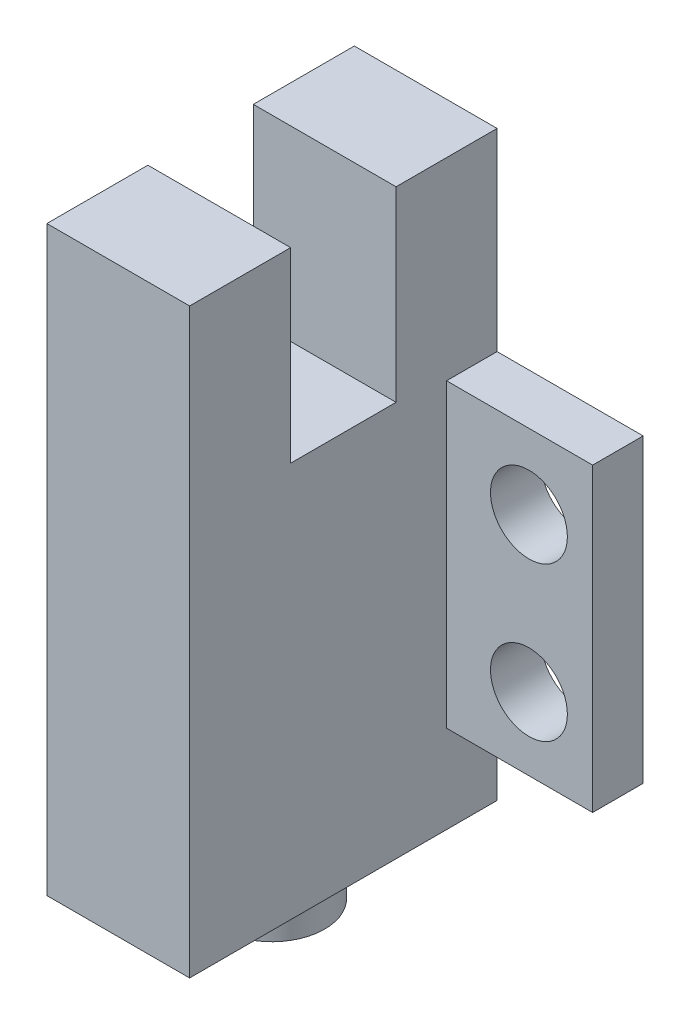
ISO-10303-21;
HEADER;
FILE_DESCRIPTION(('STEP AP214'),'2;1');
FILE_NAME('part.step','',(''),(''),'','','');
FILE_SCHEMA(('AUTOMOTIVE_DESIGN { 1 0 10303 214 1 1 1 1 }'));
ENDSEC;
DATA;
#1=APPLICATION_CONTEXT('core data for automotive mechanical design processes');
#2=APPLICATION_PROTOCOL_DEFINITION('international standard','automotive_design',2000,#1);
#3=PRODUCT_CONTEXT('',#1,'mechanical');
#4=PRODUCT('Part','Part','',(#3));
#5=PRODUCT_RELATED_PRODUCT_CATEGORY('part','',(#4));
#6=PRODUCT_DEFINITION_FORMATION('','',#4);
#7=PRODUCT_DEFINITION_CONTEXT('part definition',#1,'design');
#8=PRODUCT_DEFINITION('design','',#6,#7);
#9=PRODUCT_DEFINITION_SHAPE('','',#8);
#10=(LENGTH_UNIT() NAMED_UNIT(*) SI_UNIT(.MILLI.,.METRE.));
#11=(NAMED_UNIT(*) PLANE_ANGLE_UNIT() SI_UNIT($,.RADIAN.));
#12=(NAMED_UNIT(*) SI_UNIT($,.STERADIAN.) SOLID_ANGLE_UNIT());
#13=UNCERTAINTY_MEASURE_WITH_UNIT(LENGTH_MEASURE(1.E-05),#10,'distance_accuracy_value','');
#14=(GEOMETRIC_REPRESENTATION_CONTEXT(3) GLOBAL_UNCERTAINTY_ASSIGNED_CONTEXT((#13)) GLOBAL_UNIT_ASSIGNED_CONTEXT((#10,
#11,#12)) REPRESENTATION_CONTEXT('',''));
#15=CARTESIAN_POINT('',(0.,0.,0.));
#16=DIRECTION('',(0.,0.,1.));
#17=DIRECTION('',(1.,0.,0.));
#18=AXIS2_PLACEMENT_3D('',#15,#16,#17);
#19=CARTESIAN_POINT('',(6.5,26.5,0.));
#20=DIRECTION('',(-1.,0.,0.));
#21=DIRECTION('',(0.,0.,1.));
#22=AXIS2_PLACEMENT_3D('',#19,#20,#21);
#23=PLANE('',#22);
#24=DIRECTION('',(0.,0.,-1.));
#25=VECTOR('',#24,1.);
#26=CARTESIAN_POINT('',(6.5,4.,-14.));
#27=LINE('',#26,#25);
#28=CARTESIAN_POINT('',(6.5,4.,-11.7));
#29=VERTEX_POINT('',#28);
#30=CARTESIAN_POINT('',(6.5,4.,-14.));
#31=VERTEX_POINT('',#30);
#32=EDGE_CURVE('E51',#29,#31,#27,.T.);
#33=ORIENTED_EDGE('',*,*,#32,.F.);
#34=DIRECTION('',(0.,-1.,0.));
#35=VECTOR('',#34,1.);
#36=CARTESIAN_POINT('',(6.5,17.7,-11.7));
#37=LINE('',#36,#35);
#38=CARTESIAN_POINT('',(6.5,17.7,-11.7));
#39=VERTEX_POINT('',#38);
#40=EDGE_CURVE('E353',#39,#29,#37,.T.);
#41=ORIENTED_EDGE('',*,*,#40,.F.);
#42=DIRECTION('',(0.,0.,1.));
#43=VECTOR('',#42,1.);
#44=CARTESIAN_POINT('',(6.5,17.7,-14.));
#45=LINE('',#44,#43);
#46=CARTESIAN_POINT('',(6.5,17.7,-14.));
#47=VERTEX_POINT('',#46);
#48=EDGE_CURVE('E355',#47,#39,#45,.T.);
#49=ORIENTED_EDGE('',*,*,#48,.F.);
#50=DIRECTION('',(0.,-1.,0.));
#51=VECTOR('',#50,1.);
#52=CARTESIAN_POINT('',(6.5,26.5,-14.));
#53=LINE('',#52,#51);
#54=CARTESIAN_POINT('',(6.5,26.5,-14.));
#55=VERTEX_POINT('',#54);
#56=EDGE_CURVE('E148',#55,#47,#53,.T.);
#57=ORIENTED_EDGE('',*,*,#56,.F.);
#58=DIRECTION('',(0.,0.,-1.));
#59=VECTOR('',#58,1.);
#60=CARTESIAN_POINT('',(6.5,26.5,0.));
#61=LINE('',#60,#59);
#62=CARTESIAN_POINT('',(6.5,26.5,-9.4));
#63=VERTEX_POINT('',#62);
#64=EDGE_CURVE('E186',#63,#55,#61,.T.);
#65=ORIENTED_EDGE('',*,*,#64,.F.);
#66=DIRECTION('',(0.,1.,0.));
#67=VECTOR('',#66,1.);
#68=CARTESIAN_POINT('',(6.5,18.,-9.4));
#69=LINE('',#68,#67);
#70=CARTESIAN_POINT('',(6.5,18.,-9.4));
#71=VERTEX_POINT('',#70);
#72=EDGE_CURVE('E174',#71,#63,#69,.T.);
#73=ORIENTED_EDGE('',*,*,#72,.F.);
#74=DIRECTION('',(0.,0.,-1.));
#75=VECTOR('',#74,1.);
#76=CARTESIAN_POINT('',(6.5,18.,-9.4));
#77=LINE('',#76,#75);
#78=CARTESIAN_POINT('',(6.5,18.,-4.6));
#79=VERTEX_POINT('',#78);
#80=EDGE_CURVE('E163',#79,#71,#77,.T.);
#81=ORIENTED_EDGE('',*,*,#80,.F.);
#82=DIRECTION('',(0.,1.,0.));
#83=VECTOR('',#82,1.);
#84=CARTESIAN_POINT('',(6.5,18.,-4.6));
#85=LINE('',#84,#83);
#86=CARTESIAN_POINT('',(6.5,26.5,-4.6));
#87=VERTEX_POINT('',#86);
#88=EDGE_CURVE('E176',#79,#87,#85,.T.);
#89=ORIENTED_EDGE('',*,*,#88,.T.);
#90=CARTESIAN_POINT('',(6.5,26.5,0.));
#91=VERTEX_POINT('',#90);
#92=EDGE_CURVE('E187',#91,#87,#61,.T.);
#93=ORIENTED_EDGE('',*,*,#92,.F.);
#94=DIRECTION('',(0.,-1.,0.));
#95=VECTOR('',#94,1.);
#96=CARTESIAN_POINT('',(6.5,26.5,0.));
#97=LINE('',#96,#95);
#98=CARTESIAN_POINT('',(6.5,0.,0.));
#99=VERTEX_POINT('',#98);
#100=EDGE_CURVE('E203',#91,#99,#97,.T.);
#101=ORIENTED_EDGE('',*,*,#100,.T.);
#102=DIRECTION('',(0.,0.,-1.));
#103=VECTOR('',#102,1.);
#104=CARTESIAN_POINT('',(6.5,0.,0.));
#105=LINE('',#104,#103);
#106=CARTESIAN_POINT('',(6.5,0.,-14.));
#107=VERTEX_POINT('',#106);
#108=EDGE_CURVE('E197',#99,#107,#105,.T.);
#109=ORIENTED_EDGE('',*,*,#108,.T.);
#110=EDGE_CURVE('E56',#31,#107,#53,.T.);
#111=ORIENTED_EDGE('',*,*,#110,.F.);
#112=EDGE_LOOP('',(#33,#41,#49,#57,#65,#73,#81,#89,#93,#101,#109,#111));
#113=FACE_BOUND('',#112,.T.);
#114=ADVANCED_FACE('F35',(#113),#23,.F.);
#115=CARTESIAN_POINT('',(0.,26.5,0.));
#116=DIRECTION('',(0.,-1.,0.));
#117=DIRECTION('',(0.,0.,-1.));
#118=AXIS2_PLACEMENT_3D('',#115,#116,#117);
#119=PLANE('',#118);
#120=DIRECTION('',(0.,0.,1.));
#121=VECTOR('',#120,1.);
#122=CARTESIAN_POINT('',(0.,26.5,0.));
#123=LINE('',#122,#121);
#124=CARTESIAN_POINT('',(0.,26.5,-14.));
#125=VERTEX_POINT('',#124);
#126=CARTESIAN_POINT('',(0.,26.5,-9.4));
#127=VERTEX_POINT('',#126);
#128=EDGE_CURVE('E180',#125,#127,#123,.T.);
#129=ORIENTED_EDGE('',*,*,#128,.T.);
#130=DIRECTION('',(-1.,0.,0.));
#131=VECTOR('',#130,1.);
#132=CARTESIAN_POINT('',(0.,26.5,-9.4));
#133=LINE('',#132,#131);
#134=EDGE_CURVE('E151',#63,#127,#133,.T.);
#135=ORIENTED_EDGE('',*,*,#134,.F.);
#136=ORIENTED_EDGE('',*,*,#64,.T.);
#137=DIRECTION('',(-1.,0.,0.));
#138=VECTOR('',#137,1.);
#139=CARTESIAN_POINT('',(0.,26.5,-14.));
#140=LINE('',#139,#138);
#141=EDGE_CURVE('E190',#55,#125,#140,.T.);
#142=ORIENTED_EDGE('',*,*,#141,.T.);
#143=EDGE_LOOP('',(#129,#135,#136,#142));
#144=FACE_BOUND('',#143,.T.);
#145=ADVANCED_FACE('F223',(#144),#119,.F.);
#146=CARTESIAN_POINT('',(0.,26.5,0.));
#147=DIRECTION('',(1.,0.,0.));
#148=DIRECTION('',(0.,0.,-1.));
#149=AXIS2_PLACEMENT_3D('',#146,#147,#148);
#150=PLANE('',#149);
#151=DIRECTION('',(0.,0.,1.));
#152=VECTOR('',#151,1.);
#153=CARTESIAN_POINT('',(0.,18.,-9.4));
#154=LINE('',#153,#152);
#155=CARTESIAN_POINT('',(0.,18.,-9.4));
#156=VERTEX_POINT('',#155);
#157=CARTESIAN_POINT('',(0.,18.,-4.6));
#158=VERTEX_POINT('',#157);
#159=EDGE_CURVE('E157',#156,#158,#154,.T.);
#160=ORIENTED_EDGE('',*,*,#159,.F.);
#161=DIRECTION('',(0.,1.,0.));
#162=VECTOR('',#161,1.);
#163=CARTESIAN_POINT('',(0.,18.,-9.4));
#164=LINE('',#163,#162);
#165=EDGE_CURVE('E170',#156,#127,#164,.T.);
#166=ORIENTED_EDGE('',*,*,#165,.T.);
#167=ORIENTED_EDGE('',*,*,#128,.F.);
#168=DIRECTION('',(0.,-1.,0.));
#169=VECTOR('',#168,1.);
#170=CARTESIAN_POINT('',(0.,26.5,-14.));
#171=LINE('',#170,#169);
#172=CARTESIAN_POINT('',(0.,0.,-14.));
#173=VERTEX_POINT('',#172);
#174=EDGE_CURVE('E192',#125,#173,#171,.T.);
#175=ORIENTED_EDGE('',*,*,#174,.T.);
#176=DIRECTION('',(0.,0.,1.));
#177=VECTOR('',#176,1.);
#178=CARTESIAN_POINT('',(0.,0.,0.));
#179=LINE('',#178,#177);
#180=CARTESIAN_POINT('',(0.,0.,0.));
#181=VERTEX_POINT('',#180);
#182=EDGE_CURVE('E173',#173,#181,#179,.T.);
#183=ORIENTED_EDGE('',*,*,#182,.T.);
#184=DIRECTION('',(0.,-1.,0.));
#185=VECTOR('',#184,1.);
#186=CARTESIAN_POINT('',(0.,26.5,0.));
#187=LINE('',#186,#185);
#188=CARTESIAN_POINT('',(0.,26.5,0.));
#189=VERTEX_POINT('',#188);
#190=EDGE_CURVE('E39',#189,#181,#187,.T.);
#191=ORIENTED_EDGE('',*,*,#190,.F.);
#192=CARTESIAN_POINT('',(0.,26.5,-4.6));
#193=VERTEX_POINT('',#192);
#194=EDGE_CURVE('E184',#193,#189,#123,.T.);
#195=ORIENTED_EDGE('',*,*,#194,.F.);
#196=DIRECTION('',(0.,1.,0.));
#197=VECTOR('',#196,1.);
#198=CARTESIAN_POINT('',(0.,18.,-4.6));
#199=LINE('',#198,#197);
#200=EDGE_CURVE('E167',#158,#193,#199,.T.);
#201=ORIENTED_EDGE('',*,*,#200,.F.);
#202=EDGE_LOOP('',(#160,#166,#167,#175,#183,#191,#195,#201));
#203=FACE_BOUND('',#202,.T.);
#204=ADVANCED_FACE('F37',(#203),#150,.F.);
#205=CARTESIAN_POINT('',(0.,26.5,0.));
#206=DIRECTION('',(0.,0.,-1.));
#207=DIRECTION('',(-1.,0.,0.));
#208=AXIS2_PLACEMENT_3D('',#205,#206,#207);
#209=PLANE('',#208);
#210=DIRECTION('',(1.,0.,0.));
#211=VECTOR('',#210,1.);
#212=CARTESIAN_POINT('',(0.,0.,0.));
#213=LINE('',#212,#211);
#214=EDGE_CURVE('E195',#181,#99,#213,.T.);
#215=ORIENTED_EDGE('',*,*,#214,.T.);
#216=ORIENTED_EDGE('',*,*,#100,.F.);
#217=DIRECTION('',(1.,0.,0.));
#218=VECTOR('',#217,1.);
#219=CARTESIAN_POINT('',(0.,26.5,0.));
#220=LINE('',#219,#218);
#221=EDGE_CURVE('E183',#189,#91,#220,.T.);
#222=ORIENTED_EDGE('',*,*,#221,.F.);
#223=ORIENTED_EDGE('',*,*,#190,.T.);
#224=EDGE_LOOP('',(#215,#216,#222,#223));
#225=FACE_BOUND('',#224,.T.);
#226=ADVANCED_FACE('F212',(#225),#209,.F.);
#227=CARTESIAN_POINT('',(0.,26.5,-14.));
#228=DIRECTION('',(0.,0.,1.));
#229=DIRECTION('',(1.,0.,0.));
#230=AXIS2_PLACEMENT_3D('',#227,#228,#229);
#231=PLANE('',#230);
#232=CARTESIAN_POINT('',(10.25,14.3,-14.));
#233=DIRECTION('',(0.,0.,1.));
#234=DIRECTION('',(1.,0.,0.));
#235=AXIS2_PLACEMENT_3D('',#232,#233,#234);
#236=CIRCLE('',#235,1.75);
#237=CARTESIAN_POINT('',(12.,14.3,-14.));
#238=VERTEX_POINT('',#237);
#239=EDGE_CURVE('E356',#238,#238,#236,.T.);
#240=ORIENTED_EDGE('',*,*,#239,.T.);
#241=EDGE_LOOP('',(#240));
#242=FACE_BOUND('',#241,.T.);
#243=CARTESIAN_POINT('',(10.25,7.3,-14.));
#244=DIRECTION('',(0.,0.,1.));
#245=DIRECTION('',(1.,0.,0.));
#246=AXIS2_PLACEMENT_3D('',#243,#244,#245);
#247=CIRCLE('',#246,1.75);
#248=CARTESIAN_POINT('',(12.,7.3,-14.));
#249=VERTEX_POINT('',#248);
#250=EDGE_CURVE('E361',#249,#249,#247,.T.);
#251=ORIENTED_EDGE('',*,*,#250,.T.);
#252=EDGE_LOOP('',(#251));
#253=FACE_BOUND('',#252,.T.);
#254=DIRECTION('',(-1.,0.,0.));
#255=VECTOR('',#254,1.);
#256=CARTESIAN_POINT('',(0.,0.,-14.));
#257=LINE('',#256,#255);
#258=EDGE_CURVE('E199',#107,#173,#257,.T.);
#259=ORIENTED_EDGE('',*,*,#258,.T.);
#260=ORIENTED_EDGE('',*,*,#174,.F.);
#261=ORIENTED_EDGE('',*,*,#141,.F.);
#262=ORIENTED_EDGE('',*,*,#56,.T.);
#263=DIRECTION('',(-1.,0.,0.));
#264=VECTOR('',#263,1.);
#265=CARTESIAN_POINT('',(13.15,17.7,-14.));
#266=LINE('',#265,#264);
#267=CARTESIAN_POINT('',(13.15,17.7,-14.));
#268=VERTEX_POINT('',#267);
#269=EDGE_CURVE('E128',#268,#47,#266,.T.);
#270=ORIENTED_EDGE('',*,*,#269,.F.);
#271=DIRECTION('',(0.,1.,0.));
#272=VECTOR('',#271,1.);
#273=CARTESIAN_POINT('',(13.15,17.7,-14.));
#274=LINE('',#273,#272);
#275=CARTESIAN_POINT('',(13.15,4.,-14.));
#276=VERTEX_POINT('',#275);
#277=EDGE_CURVE('E134',#276,#268,#274,.T.);
#278=ORIENTED_EDGE('',*,*,#277,.F.);
#279=DIRECTION('',(-1.,0.,0.));
#280=VECTOR('',#279,1.);
#281=CARTESIAN_POINT('',(13.15,4.,-14.));
#282=LINE('',#281,#280);
#283=EDGE_CURVE('E347',#276,#31,#282,.T.);
#284=ORIENTED_EDGE('',*,*,#283,.T.);
#285=ORIENTED_EDGE('',*,*,#110,.T.);
#286=EDGE_LOOP('',(#259,#260,#261,#262,#270,#278,#284,#285));
#287=FACE_BOUND('',#286,.T.);
#288=ADVANCED_FACE('F145',(#242,#253,#287),#231,.F.);
#289=ORIENTED_EDGE('',*,*,#92,.T.);
#290=DIRECTION('',(1.,0.,0.));
#291=VECTOR('',#290,1.);
#292=CARTESIAN_POINT('',(0.,26.5,-4.6));
#293=LINE('',#292,#291);
#294=EDGE_CURVE('E149',#193,#87,#293,.T.);
#295=ORIENTED_EDGE('',*,*,#294,.F.);
#296=ORIENTED_EDGE('',*,*,#194,.T.);
#297=ORIENTED_EDGE('',*,*,#221,.T.);
#298=EDGE_LOOP('',(#289,#295,#296,#297));
#299=FACE_BOUND('',#298,.T.);
#300=ADVANCED_FACE('F230',(#299),#119,.F.);
#301=CARTESIAN_POINT('',(0.,0.,0.));
#302=DIRECTION('',(0.,-1.,0.));
#303=DIRECTION('',(0.,0.,-1.));
#304=AXIS2_PLACEMENT_3D('',#301,#302,#303);
#305=PLANE('',#304);
#306=CARTESIAN_POINT('',(3.25,0.,-7.));
#307=DIRECTION('',(0.,-1.,0.));
#308=DIRECTION('',(0.,0.,-1.));
#309=AXIS2_PLACEMENT_3D('',#306,#307,#308);
#310=CIRCLE('',#309,2.4);
#311=CARTESIAN_POINT('',(3.25,0.,-9.4));
#312=VERTEX_POINT('',#311);
#313=EDGE_CURVE('E11',#312,#312,#310,.T.);
#314=ORIENTED_EDGE('',*,*,#313,.F.);
#315=EDGE_LOOP('',(#314));
#316=FACE_BOUND('',#315,.T.);
#317=ORIENTED_EDGE('',*,*,#182,.F.);
#318=ORIENTED_EDGE('',*,*,#258,.F.);
#319=ORIENTED_EDGE('',*,*,#108,.F.);
#320=ORIENTED_EDGE('',*,*,#214,.F.);
#321=EDGE_LOOP('',(#317,#318,#319,#320));
#322=FACE_BOUND('',#321,.T.);
#323=ADVANCED_FACE('F221',(#316,#322),#305,.T.);
#324=CARTESIAN_POINT('',(0.,18.,-9.4));
#325=DIRECTION('',(0.,0.,-1.));
#326=DIRECTION('',(-1.,0.,0.));
#327=AXIS2_PLACEMENT_3D('',#324,#325,#326);
#328=PLANE('',#327);
#329=ORIENTED_EDGE('',*,*,#134,.T.);
#330=ORIENTED_EDGE('',*,*,#165,.F.);
#331=DIRECTION('',(-1.,0.,0.));
#332=VECTOR('',#331,1.);
#333=CARTESIAN_POINT('',(0.,18.,-9.4));
#334=LINE('',#333,#332);
#335=EDGE_CURVE('E165',#71,#156,#334,.T.);
#336=ORIENTED_EDGE('',*,*,#335,.F.);
#337=ORIENTED_EDGE('',*,*,#72,.T.);
#338=EDGE_LOOP('',(#329,#330,#336,#337));
#339=FACE_BOUND('',#338,.T.);
#340=ADVANCED_FACE('F278',(#339),#328,.F.);
#341=CARTESIAN_POINT('',(0.,18.,-4.6));
#342=DIRECTION('',(0.,0.,1.));
#343=DIRECTION('',(1.,0.,0.));
#344=AXIS2_PLACEMENT_3D('',#341,#342,#343);
#345=PLANE('',#344);
#346=ORIENTED_EDGE('',*,*,#294,.T.);
#347=ORIENTED_EDGE('',*,*,#88,.F.);
#348=DIRECTION('',(1.,0.,0.));
#349=VECTOR('',#348,1.);
#350=CARTESIAN_POINT('',(0.,18.,-4.6));
#351=LINE('',#350,#349);
#352=EDGE_CURVE('E160',#158,#79,#351,.T.);
#353=ORIENTED_EDGE('',*,*,#352,.F.);
#354=ORIENTED_EDGE('',*,*,#200,.T.);
#355=EDGE_LOOP('',(#346,#347,#353,#354));
#356=FACE_BOUND('',#355,.T.);
#357=ADVANCED_FACE('F332',(#356),#345,.F.);
#358=CARTESIAN_POINT('',(0.,18.,0.));
#359=DIRECTION('',(0.,1.,0.));
#360=DIRECTION('',(0.,0.,1.));
#361=AXIS2_PLACEMENT_3D('',#358,#359,#360);
#362=PLANE('',#361);
#363=ORIENTED_EDGE('',*,*,#159,.T.);
#364=ORIENTED_EDGE('',*,*,#352,.T.);
#365=ORIENTED_EDGE('',*,*,#80,.T.);
#366=ORIENTED_EDGE('',*,*,#335,.T.);
#367=EDGE_LOOP('',(#363,#364,#365,#366));
#368=FACE_BOUND('',#367,.T.);
#369=ADVANCED_FACE('F329',(#368),#362,.T.);
#370=CARTESIAN_POINT('',(13.15,17.7,-14.));
#371=DIRECTION('',(0.,-1.,0.));
#372=DIRECTION('',(0.,0.,-1.));
#373=AXIS2_PLACEMENT_3D('',#370,#371,#372);
#374=PLANE('',#373);
#375=ORIENTED_EDGE('',*,*,#48,.T.);
#376=DIRECTION('',(-1.,0.,0.));
#377=VECTOR('',#376,1.);
#378=CARTESIAN_POINT('',(13.15,17.7,-11.7));
#379=LINE('',#378,#377);
#380=CARTESIAN_POINT('',(13.15,17.7,-11.7));
#381=VERTEX_POINT('',#380);
#382=EDGE_CURVE('E130',#381,#39,#379,.T.);
#383=ORIENTED_EDGE('',*,*,#382,.F.);
#384=DIRECTION('',(0.,0.,1.));
#385=VECTOR('',#384,1.);
#386=CARTESIAN_POINT('',(13.15,17.7,-14.));
#387=LINE('',#386,#385);
#388=EDGE_CURVE('E123',#268,#381,#387,.T.);
#389=ORIENTED_EDGE('',*,*,#388,.F.);
#390=ORIENTED_EDGE('',*,*,#269,.T.);
#391=EDGE_LOOP('',(#375,#383,#389,#390));
#392=FACE_BOUND('',#391,.T.);
#393=ADVANCED_FACE('F126',(#392),#374,.F.);
#394=CARTESIAN_POINT('',(13.15,17.7,-11.7));
#395=DIRECTION('',(0.,0.,-1.));
#396=DIRECTION('',(0.,1.,0.));
#397=AXIS2_PLACEMENT_3D('',#394,#395,#396);
#398=PLANE('',#397);
#399=CARTESIAN_POINT('',(10.25,14.3,-11.7));
#400=DIRECTION('',(0.,0.,1.));
#401=DIRECTION('',(1.,0.,0.));
#402=AXIS2_PLACEMENT_3D('',#399,#400,#401);
#403=CIRCLE('',#402,1.75);
#404=CARTESIAN_POINT('',(12.,14.3,-11.7));
#405=VERTEX_POINT('',#404);
#406=EDGE_CURVE('E364',#405,#405,#403,.T.);
#407=ORIENTED_EDGE('',*,*,#406,.F.);
#408=EDGE_LOOP('',(#407));
#409=FACE_BOUND('',#408,.T.);
#410=CARTESIAN_POINT('',(10.25,7.3,-11.7));
#411=DIRECTION('',(0.,0.,1.));
#412=DIRECTION('',(1.,0.,0.));
#413=AXIS2_PLACEMENT_3D('',#410,#411,#412);
#414=CIRCLE('',#413,1.75);
#415=CARTESIAN_POINT('',(12.,7.3,-11.7));
#416=VERTEX_POINT('',#415);
#417=EDGE_CURVE('E365',#416,#416,#414,.T.);
#418=ORIENTED_EDGE('',*,*,#417,.F.);
#419=EDGE_LOOP('',(#418));
#420=FACE_BOUND('',#419,.T.);
#421=ORIENTED_EDGE('',*,*,#40,.T.);
#422=DIRECTION('',(-1.,0.,0.));
#423=VECTOR('',#422,1.);
#424=CARTESIAN_POINT('',(13.15,4.,-11.7));
#425=LINE('',#424,#423);
#426=CARTESIAN_POINT('',(13.15,4.,-11.7));
#427=VERTEX_POINT('',#426);
#428=EDGE_CURVE('E153',#427,#29,#425,.T.);
#429=ORIENTED_EDGE('',*,*,#428,.F.);
#430=DIRECTION('',(0.,-1.,0.));
#431=VECTOR('',#430,1.);
#432=CARTESIAN_POINT('',(13.15,17.7,-11.7));
#433=LINE('',#432,#431);
#434=EDGE_CURVE('E133',#381,#427,#433,.T.);
#435=ORIENTED_EDGE('',*,*,#434,.F.);
#436=ORIENTED_EDGE('',*,*,#382,.T.);
#437=EDGE_LOOP('',(#421,#429,#435,#436));
#438=FACE_BOUND('',#437,.T.);
#439=ADVANCED_FACE('F322',(#409,#420,#438),#398,.F.);
#440=CARTESIAN_POINT('',(13.15,4.,-14.));
#441=DIRECTION('',(0.,1.,0.));
#442=DIRECTION('',(0.,0.,1.));
#443=AXIS2_PLACEMENT_3D('',#440,#441,#442);
#444=PLANE('',#443);
#445=ORIENTED_EDGE('',*,*,#32,.T.);
#446=ORIENTED_EDGE('',*,*,#283,.F.);
#447=DIRECTION('',(0.,0.,-1.));
#448=VECTOR('',#447,1.);
#449=CARTESIAN_POINT('',(13.15,4.,-14.));
#450=LINE('',#449,#448);
#451=EDGE_CURVE('E139',#427,#276,#450,.T.);
#452=ORIENTED_EDGE('',*,*,#451,.F.);
#453=ORIENTED_EDGE('',*,*,#428,.T.);
#454=EDGE_LOOP('',(#445,#446,#452,#453));
#455=FACE_BOUND('',#454,.T.);
#456=ADVANCED_FACE('F319',(#455),#444,.F.);
#457=CARTESIAN_POINT('',(13.15,0.,0.));
#458=DIRECTION('',(-1.,0.,0.));
#459=DIRECTION('',(0.,0.,1.));
#460=AXIS2_PLACEMENT_3D('',#457,#458,#459);
#461=PLANE('',#460);
#462=ORIENTED_EDGE('',*,*,#277,.T.);
#463=ORIENTED_EDGE('',*,*,#388,.T.);
#464=ORIENTED_EDGE('',*,*,#434,.T.);
#465=ORIENTED_EDGE('',*,*,#451,.T.);
#466=EDGE_LOOP('',(#462,#463,#464,#465));
#467=FACE_BOUND('',#466,.T.);
#468=ADVANCED_FACE('F137',(#467),#461,.F.);
#469=CARTESIAN_POINT('',(10.25,7.3,-18.35));
#470=DIRECTION('',(0.,0.,1.));
#471=DIRECTION('',(1.,0.,0.));
#472=AXIS2_PLACEMENT_3D('',#469,#470,#471);
#473=CYLINDRICAL_SURFACE('',#472,1.75);
#474=ORIENTED_EDGE('',*,*,#417,.T.);
#475=EDGE_LOOP('',(#474));
#476=FACE_BOUND('',#475,.T.);
#477=ORIENTED_EDGE('',*,*,#250,.F.);
#478=EDGE_LOOP('',(#477));
#479=FACE_BOUND('',#478,.T.);
#480=ADVANCED_FACE('F312',(#476,#479),#473,.F.);
#481=CARTESIAN_POINT('',(10.25,14.3,-18.35));
#482=DIRECTION('',(0.,0.,1.));
#483=DIRECTION('',(1.,0.,0.));
#484=AXIS2_PLACEMENT_3D('',#481,#482,#483);
#485=CYLINDRICAL_SURFACE('',#484,1.75);
#486=ORIENTED_EDGE('',*,*,#406,.T.);
#487=EDGE_LOOP('',(#486));
#488=FACE_BOUND('',#487,.T.);
#489=ORIENTED_EDGE('',*,*,#239,.F.);
#490=EDGE_LOOP('',(#489));
#491=FACE_BOUND('',#490,.T.);
#492=ADVANCED_FACE('F285',(#488,#491),#485,.F.);
#493=CARTESIAN_POINT('',(3.25,-2.,-7.));
#494=DIRECTION('',(0.,1.,0.));
#495=DIRECTION('',(0.,0.,1.));
#496=AXIS2_PLACEMENT_3D('',#493,#494,#495);
#497=CYLINDRICAL_SURFACE('',#496,2.4);
#498=CARTESIAN_POINT('',(3.25,-2.,-7.));
#499=DIRECTION('',(0.,-1.,0.));
#500=DIRECTION('',(0.,0.,-1.));
#501=AXIS2_PLACEMENT_3D('',#498,#499,#500);
#502=CIRCLE('',#501,2.4);
#503=CARTESIAN_POINT('',(3.25,-2.,-9.4));
#504=VERTEX_POINT('',#503);
#505=EDGE_CURVE('E368',#504,#504,#502,.T.);
#506=ORIENTED_EDGE('',*,*,#505,.F.);
#507=EDGE_LOOP('',(#506));
#508=FACE_BOUND('',#507,.T.);
#509=ORIENTED_EDGE('',*,*,#313,.T.);
#510=EDGE_LOOP('',(#509));
#511=FACE_BOUND('',#510,.T.);
#512=ADVANCED_FACE('F290',(#508,#511),#497,.T.);
#513=CARTESIAN_POINT('',(3.25,-2.,-7.));
#514=DIRECTION('',(0.,-1.,0.));
#515=DIRECTION('',(0.,0.,-1.));
#516=AXIS2_PLACEMENT_3D('',#513,#514,#515);
#517=PLANE('',#516);
#518=ORIENTED_EDGE('',*,*,#505,.T.);
#519=EDGE_LOOP('',(#518));
#520=FACE_BOUND('',#519,.T.);
#521=ADVANCED_FACE('F295',(#520),#517,.T.);
#522=CLOSED_SHELL('',(#114,#145,#204,#226,#288,#300,#323,#340,#357,#369,#393,#439,#456,#468,
#480,#492,#512,#521));
#523=MANIFOLD_SOLID_BREP('B2',#522);
#524=ADVANCED_BREP_SHAPE_REPRESENTATION('',(#18,#523),#14);
#525=SHAPE_DEFINITION_REPRESENTATION(#9,#524);
ENDSEC;
END-ISO-10303-21;
